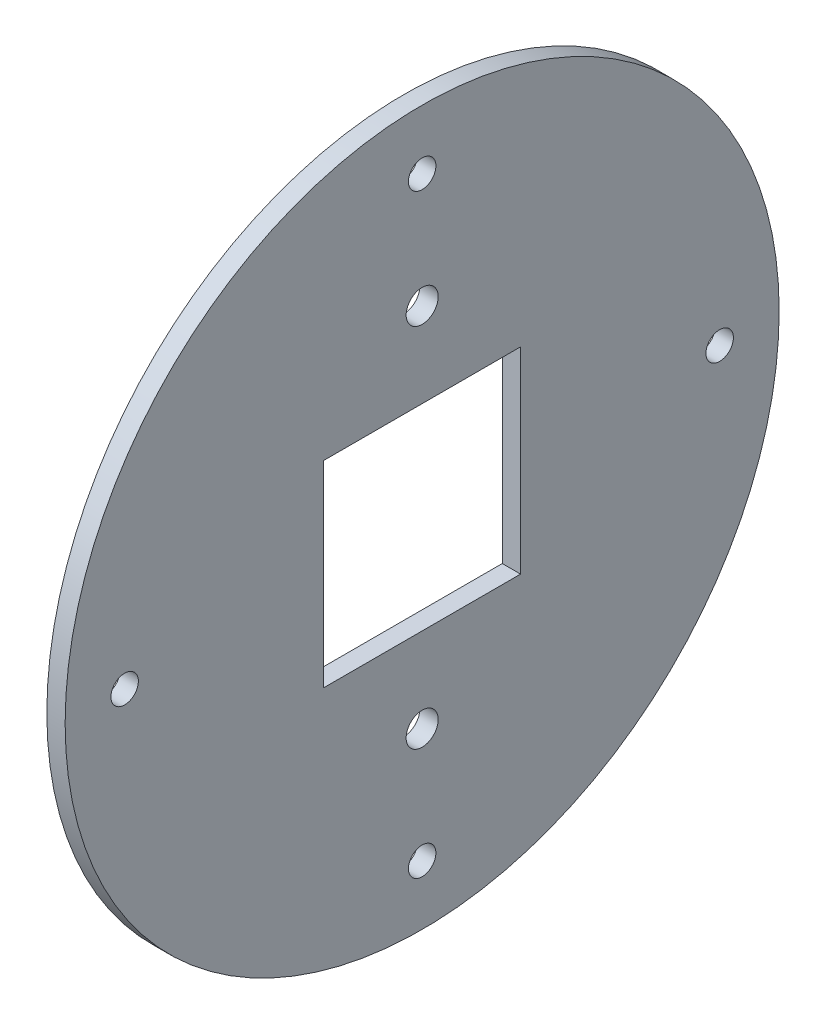
ISO-10303-21;
HEADER;
FILE_DESCRIPTION(('STEP AP214'),'2;1');
FILE_NAME('part.step','',(''),(''),'','','');
FILE_SCHEMA(('AUTOMOTIVE_DESIGN { 1 0 10303 214 1 1 1 1 }'));
ENDSEC;
DATA;
#1=APPLICATION_CONTEXT('core data for automotive mechanical design processes');
#2=APPLICATION_PROTOCOL_DEFINITION('international standard','automotive_design',2000,#1);
#3=PRODUCT_CONTEXT('',#1,'mechanical');
#4=PRODUCT('Part','Part','',(#3));
#5=PRODUCT_RELATED_PRODUCT_CATEGORY('part','',(#4));
#6=PRODUCT_DEFINITION_FORMATION('','',#4);
#7=PRODUCT_DEFINITION_CONTEXT('part definition',#1,'design');
#8=PRODUCT_DEFINITION('design','',#6,#7);
#9=PRODUCT_DEFINITION_SHAPE('','',#8);
#10=(LENGTH_UNIT() NAMED_UNIT(*) SI_UNIT(.MILLI.,.METRE.));
#11=(NAMED_UNIT(*) PLANE_ANGLE_UNIT() SI_UNIT($,.RADIAN.));
#12=(NAMED_UNIT(*) SI_UNIT($,.STERADIAN.) SOLID_ANGLE_UNIT());
#13=UNCERTAINTY_MEASURE_WITH_UNIT(LENGTH_MEASURE(1.E-05),#10,'distance_accuracy_value','');
#14=(GEOMETRIC_REPRESENTATION_CONTEXT(3) GLOBAL_UNCERTAINTY_ASSIGNED_CONTEXT((#13)) GLOBAL_UNIT_ASSIGNED_CONTEXT((#10,
#11,#12)) REPRESENTATION_CONTEXT('',''));
#15=CARTESIAN_POINT('',(0.,0.,0.));
#16=DIRECTION('',(0.,0.,1.));
#17=DIRECTION('',(1.,0.,0.));
#18=AXIS2_PLACEMENT_3D('',#15,#16,#17);
#19=CARTESIAN_POINT('',(8.,0.,0.));
#20=DIRECTION('',(-1.,0.,0.));
#21=DIRECTION('',(0.,0.,1.));
#22=AXIS2_PLACEMENT_3D('',#19,#20,#21);
#23=CYLINDRICAL_SURFACE('',#22,156.);
#24=CARTESIAN_POINT('',(8.,0.,0.));
#25=DIRECTION('',(1.,0.,0.));
#26=DIRECTION('',(0.,0.,-1.));
#27=AXIS2_PLACEMENT_3D('',#24,#25,#26);
#28=CIRCLE('',#27,156.);
#29=CARTESIAN_POINT('',(8.,0.,-156.));
#30=VERTEX_POINT('',#29);
#31=EDGE_CURVE('E136',#30,#30,#28,.T.);
#32=ORIENTED_EDGE('',*,*,#31,.F.);
#33=EDGE_LOOP('',(#32));
#34=FACE_BOUND('',#33,.T.);
#35=CARTESIAN_POINT('',(0.,0.,0.));
#36=DIRECTION('',(1.,0.,0.));
#37=DIRECTION('',(0.,0.,-1.));
#38=AXIS2_PLACEMENT_3D('',#35,#36,#37);
#39=CIRCLE('',#38,156.);
#40=CARTESIAN_POINT('',(0.,0.,-156.));
#41=VERTEX_POINT('',#40);
#42=EDGE_CURVE('E141',#41,#41,#39,.T.);
#43=ORIENTED_EDGE('',*,*,#42,.T.);
#44=EDGE_LOOP('',(#43));
#45=FACE_BOUND('',#44,.T.);
#46=ADVANCED_FACE('F39',(#34,#45),#23,.T.);
#47=CARTESIAN_POINT('',(8.,0.,0.));
#48=DIRECTION('',(1.,0.,0.));
#49=DIRECTION('',(0.,0.,-1.));
#50=AXIS2_PLACEMENT_3D('',#47,#48,#49);
#51=PLANE('',#50);
#52=CARTESIAN_POINT('',(8.,80.,0.));
#53=DIRECTION('',(1.,0.,0.));
#54=DIRECTION('',(0.,0.,-1.));
#55=AXIS2_PLACEMENT_3D('',#52,#53,#54);
#56=CIRCLE('',#55,7.);
#57=CARTESIAN_POINT('',(8.,80.,-7.));
#58=VERTEX_POINT('',#57);
#59=EDGE_CURVE('E167',#58,#58,#56,.T.);
#60=ORIENTED_EDGE('',*,*,#59,.F.);
#61=EDGE_LOOP('',(#60));
#62=FACE_BOUND('',#61,.T.);
#63=CARTESIAN_POINT('',(8.,-80.,0.));
#64=DIRECTION('',(1.,0.,0.));
#65=DIRECTION('',(0.,0.,-1.));
#66=AXIS2_PLACEMENT_3D('',#63,#64,#65);
#67=CIRCLE('',#66,7.);
#68=CARTESIAN_POINT('',(8.,-80.,-7.));
#69=VERTEX_POINT('',#68);
#70=EDGE_CURVE('E174',#69,#69,#67,.T.);
#71=ORIENTED_EDGE('',*,*,#70,.F.);
#72=EDGE_LOOP('',(#71));
#73=FACE_BOUND('',#72,.T.);
#74=DIRECTION('',(0.,1.,0.));
#75=VECTOR('',#74,1.);
#76=CARTESIAN_POINT('',(8.,-42.9999999999999,-42.9999999999999));
#77=LINE('',#76,#75);
#78=CARTESIAN_POINT('',(8.,-42.9999999999999,-42.9999999999999));
#79=VERTEX_POINT('',#78);
#80=CARTESIAN_POINT('',(8.,43.0000000000001,-42.9999999999999));
#81=VERTEX_POINT('',#80);
#82=EDGE_CURVE('E56',#79,#81,#77,.T.);
#83=ORIENTED_EDGE('',*,*,#82,.F.);
#84=DIRECTION('',(0.,0.,-1.));
#85=VECTOR('',#84,1.);
#86=CARTESIAN_POINT('',(8.,-43.0000000000002,43.0000000000001));
#87=LINE('',#86,#85);
#88=CARTESIAN_POINT('',(8.,-43.0000000000002,43.0000000000001));
#89=VERTEX_POINT('',#88);
#90=EDGE_CURVE('E103',#89,#79,#87,.T.);
#91=ORIENTED_EDGE('',*,*,#90,.F.);
#92=DIRECTION('',(0.,-1.,0.));
#93=VECTOR('',#92,1.);
#94=CARTESIAN_POINT('',(8.,-43.0000000000002,43.0000000000001));
#95=LINE('',#94,#93);
#96=CARTESIAN_POINT('',(8.,43.0000000000001,43.0000000000001));
#97=VERTEX_POINT('',#96);
#98=EDGE_CURVE('E85',#97,#89,#95,.T.);
#99=ORIENTED_EDGE('',*,*,#98,.F.);
#100=DIRECTION('',(0.,0.,1.));
#101=VECTOR('',#100,1.);
#102=CARTESIAN_POINT('',(8.,43.0000000000001,43.0000000000001));
#103=LINE('',#102,#101);
#104=EDGE_CURVE('E95',#81,#97,#103,.T.);
#105=ORIENTED_EDGE('',*,*,#104,.F.);
#106=EDGE_LOOP('',(#83,#91,#99,#105));
#107=FACE_BOUND('',#106,.T.);
#108=CARTESIAN_POINT('',(8.,-4.53892574049607E-13,130.));
#109=DIRECTION('',(1.,0.,0.));
#110=DIRECTION('',(0.,1.,0.));
#111=AXIS2_PLACEMENT_3D('',#108,#109,#110);
#112=CIRCLE('',#111,6.00000000000001);
#113=CARTESIAN_POINT('',(8.,5.99999999999955,130.));
#114=VERTEX_POINT('',#113);
#115=EDGE_CURVE('E118',#114,#114,#112,.T.);
#116=ORIENTED_EDGE('',*,*,#115,.F.);
#117=EDGE_LOOP('',(#116));
#118=FACE_BOUND('',#117,.T.);
#119=CARTESIAN_POINT('',(8.,-130.,0.));
#120=DIRECTION('',(1.,0.,0.));
#121=DIRECTION('',(0.,0.,1.));
#122=AXIS2_PLACEMENT_3D('',#119,#120,#121);
#123=CIRCLE('',#122,6.00000000000001);
#124=CARTESIAN_POINT('',(8.,-130.,6.00000000000001));
#125=VERTEX_POINT('',#124);
#126=EDGE_CURVE('E123',#125,#125,#123,.T.);
#127=ORIENTED_EDGE('',*,*,#126,.F.);
#128=EDGE_LOOP('',(#127));
#129=FACE_BOUND('',#128,.T.);
#130=CARTESIAN_POINT('',(8.,1.36167772214882E-12,-130.));
#131=DIRECTION('',(1.,0.,0.));
#132=DIRECTION('',(0.,-1.,0.));
#133=AXIS2_PLACEMENT_3D('',#130,#131,#132);
#134=CIRCLE('',#133,6.00000000000001);
#135=CARTESIAN_POINT('',(8.,-5.99999999999865,-130.));
#136=VERTEX_POINT('',#135);
#137=EDGE_CURVE('E113',#136,#136,#134,.T.);
#138=ORIENTED_EDGE('',*,*,#137,.F.);
#139=EDGE_LOOP('',(#138));
#140=FACE_BOUND('',#139,.T.);
#141=CARTESIAN_POINT('',(8.,130.,0.));
#142=DIRECTION('',(1.,0.,0.));
#143=DIRECTION('',(0.,0.,-1.));
#144=AXIS2_PLACEMENT_3D('',#141,#142,#143);
#145=CIRCLE('',#144,6.00000000000001);
#146=CARTESIAN_POINT('',(8.,130.,-6.00000000000001));
#147=VERTEX_POINT('',#146);
#148=EDGE_CURVE('E130',#147,#147,#145,.T.);
#149=ORIENTED_EDGE('',*,*,#148,.F.);
#150=EDGE_LOOP('',(#149));
#151=FACE_BOUND('',#150,.T.);
#152=ORIENTED_EDGE('',*,*,#31,.T.);
#153=EDGE_LOOP('',(#152));
#154=FACE_BOUND('',#153,.T.);
#155=ADVANCED_FACE('F100',(#62,#73,#107,#118,#129,#140,#151,#154),#51,.T.);
#156=CARTESIAN_POINT('',(0.,0.,0.));
#157=DIRECTION('',(1.,0.,0.));
#158=DIRECTION('',(0.,0.,-1.));
#159=AXIS2_PLACEMENT_3D('',#156,#157,#158);
#160=PLANE('',#159);
#161=CARTESIAN_POINT('',(0.,80.,0.));
#162=DIRECTION('',(1.,0.,0.));
#163=DIRECTION('',(0.,0.,-1.));
#164=AXIS2_PLACEMENT_3D('',#161,#162,#163);
#165=CIRCLE('',#164,7.);
#166=CARTESIAN_POINT('',(0.,80.,-7.));
#167=VERTEX_POINT('',#166);
#168=EDGE_CURVE('E42',#167,#167,#165,.T.);
#169=ORIENTED_EDGE('',*,*,#168,.T.);
#170=EDGE_LOOP('',(#169));
#171=FACE_BOUND('',#170,.T.);
#172=CARTESIAN_POINT('',(0.,-80.,0.));
#173=DIRECTION('',(1.,0.,0.));
#174=DIRECTION('',(0.,0.,-1.));
#175=AXIS2_PLACEMENT_3D('',#172,#173,#174);
#176=CIRCLE('',#175,7.);
#177=CARTESIAN_POINT('',(0.,-80.,-7.));
#178=VERTEX_POINT('',#177);
#179=EDGE_CURVE('E164',#178,#178,#176,.T.);
#180=ORIENTED_EDGE('',*,*,#179,.T.);
#181=EDGE_LOOP('',(#180));
#182=FACE_BOUND('',#181,.T.);
#183=DIRECTION('',(0.,0.,-1.));
#184=VECTOR('',#183,1.);
#185=CARTESIAN_POINT('',(0.,-43.0000000000001,-1.56125112837913E-13));
#186=LINE('',#185,#184);
#187=CARTESIAN_POINT('',(0.,-43.0000000000002,43.0000000000001));
#188=VERTEX_POINT('',#187);
#189=CARTESIAN_POINT('',(0.,-42.9999999999999,-42.9999999999999));
#190=VERTEX_POINT('',#189);
#191=EDGE_CURVE('E48',#188,#190,#186,.T.);
#192=ORIENTED_EDGE('',*,*,#191,.T.);
#193=DIRECTION('',(0.,1.,0.));
#194=VECTOR('',#193,1.);
#195=CARTESIAN_POINT('',(0.,0.,-42.9999999999999));
#196=LINE('',#195,#194);
#197=CARTESIAN_POINT('',(0.,43.0000000000001,-42.9999999999999));
#198=VERTEX_POINT('',#197);
#199=EDGE_CURVE('E11',#190,#198,#196,.T.);
#200=ORIENTED_EDGE('',*,*,#199,.T.);
#201=DIRECTION('',(0.,0.,1.));
#202=VECTOR('',#201,1.);
#203=CARTESIAN_POINT('',(0.,43.0000000000001,0.));
#204=LINE('',#203,#202);
#205=CARTESIAN_POINT('',(0.,43.0000000000001,43.0000000000001));
#206=VERTEX_POINT('',#205);
#207=EDGE_CURVE('E140',#198,#206,#204,.T.);
#208=ORIENTED_EDGE('',*,*,#207,.T.);
#209=DIRECTION('',(0.,-1.,0.));
#210=VECTOR('',#209,1.);
#211=CARTESIAN_POINT('',(0.,0.,43.0000000000001));
#212=LINE('',#211,#210);
#213=EDGE_CURVE('E88',#206,#188,#212,.T.);
#214=ORIENTED_EDGE('',*,*,#213,.T.);
#215=EDGE_LOOP('',(#192,#200,#208,#214));
#216=FACE_BOUND('',#215,.T.);
#217=CARTESIAN_POINT('',(0.,-4.53892574049607E-13,130.));
#218=DIRECTION('',(1.,0.,0.));
#219=DIRECTION('',(0.,0.,-1.));
#220=AXIS2_PLACEMENT_3D('',#217,#218,#219);
#221=CIRCLE('',#220,6.00000000000001);
#222=CARTESIAN_POINT('',(0.,-4.53892574049607E-13,124.));
#223=VERTEX_POINT('',#222);
#224=EDGE_CURVE('E135',#223,#223,#221,.T.);
#225=ORIENTED_EDGE('',*,*,#224,.T.);
#226=EDGE_LOOP('',(#225));
#227=FACE_BOUND('',#226,.T.);
#228=CARTESIAN_POINT('',(0.,-130.,0.));
#229=DIRECTION('',(1.,0.,0.));
#230=DIRECTION('',(0.,0.,-1.));
#231=AXIS2_PLACEMENT_3D('',#228,#229,#230);
#232=CIRCLE('',#231,6.00000000000001);
#233=CARTESIAN_POINT('',(0.,-130.,-6.00000000000001));
#234=VERTEX_POINT('',#233);
#235=EDGE_CURVE('E151',#234,#234,#232,.T.);
#236=ORIENTED_EDGE('',*,*,#235,.T.);
#237=EDGE_LOOP('',(#236));
#238=FACE_BOUND('',#237,.T.);
#239=CARTESIAN_POINT('',(0.,1.36167772214882E-12,-130.));
#240=DIRECTION('',(1.,0.,0.));
#241=DIRECTION('',(0.,0.,-1.));
#242=AXIS2_PLACEMENT_3D('',#239,#240,#241);
#243=CIRCLE('',#242,6.00000000000001);
#244=CARTESIAN_POINT('',(0.,1.36167772214882E-12,-136.));
#245=VERTEX_POINT('',#244);
#246=EDGE_CURVE('E122',#245,#245,#243,.T.);
#247=ORIENTED_EDGE('',*,*,#246,.T.);
#248=EDGE_LOOP('',(#247));
#249=FACE_BOUND('',#248,.T.);
#250=CARTESIAN_POINT('',(0.,130.,0.));
#251=DIRECTION('',(1.,0.,0.));
#252=DIRECTION('',(0.,0.,-1.));
#253=AXIS2_PLACEMENT_3D('',#250,#251,#252);
#254=CIRCLE('',#253,6.00000000000001);
#255=CARTESIAN_POINT('',(0.,130.,-6.00000000000001));
#256=VERTEX_POINT('',#255);
#257=EDGE_CURVE('E134',#256,#256,#254,.T.);
#258=ORIENTED_EDGE('',*,*,#257,.T.);
#259=EDGE_LOOP('',(#258));
#260=FACE_BOUND('',#259,.T.);
#261=ORIENTED_EDGE('',*,*,#42,.F.);
#262=EDGE_LOOP('',(#261));
#263=FACE_BOUND('',#262,.T.);
#264=ADVANCED_FACE('F188',(#171,#182,#216,#227,#238,#249,#260,#263),#160,.F.);
#265=CARTESIAN_POINT('',(-2.,130.,0.));
#266=DIRECTION('',(1.,0.,0.));
#267=DIRECTION('',(0.,0.,-1.));
#268=AXIS2_PLACEMENT_3D('',#265,#266,#267);
#269=CYLINDRICAL_SURFACE('',#268,6.00000000000001);
#270=ORIENTED_EDGE('',*,*,#148,.T.);
#271=EDGE_LOOP('',(#270));
#272=FACE_BOUND('',#271,.T.);
#273=ORIENTED_EDGE('',*,*,#257,.F.);
#274=EDGE_LOOP('',(#273));
#275=FACE_BOUND('',#274,.T.);
#276=ADVANCED_FACE('F195',(#272,#275),#269,.F.);
#277=CARTESIAN_POINT('',(-2.,1.36167772214882E-12,-130.));
#278=DIRECTION('',(1.,0.,0.));
#279=DIRECTION('',(0.,0.,-1.));
#280=AXIS2_PLACEMENT_3D('',#277,#278,#279);
#281=CYLINDRICAL_SURFACE('',#280,6.00000000000001);
#282=ORIENTED_EDGE('',*,*,#137,.T.);
#283=EDGE_LOOP('',(#282));
#284=FACE_BOUND('',#283,.T.);
#285=ORIENTED_EDGE('',*,*,#246,.F.);
#286=EDGE_LOOP('',(#285));
#287=FACE_BOUND('',#286,.T.);
#288=ADVANCED_FACE('F201',(#284,#287),#281,.F.);
#289=CARTESIAN_POINT('',(-2.,-130.,0.));
#290=DIRECTION('',(1.,0.,0.));
#291=DIRECTION('',(0.,0.,-1.));
#292=AXIS2_PLACEMENT_3D('',#289,#290,#291);
#293=CYLINDRICAL_SURFACE('',#292,6.00000000000001);
#294=ORIENTED_EDGE('',*,*,#126,.T.);
#295=EDGE_LOOP('',(#294));
#296=FACE_BOUND('',#295,.T.);
#297=ORIENTED_EDGE('',*,*,#235,.F.);
#298=EDGE_LOOP('',(#297));
#299=FACE_BOUND('',#298,.T.);
#300=ADVANCED_FACE('F205',(#296,#299),#293,.F.);
#301=CARTESIAN_POINT('',(-2.,-4.53892574049607E-13,130.));
#302=DIRECTION('',(1.,0.,0.));
#303=DIRECTION('',(0.,0.,-1.));
#304=AXIS2_PLACEMENT_3D('',#301,#302,#303);
#305=CYLINDRICAL_SURFACE('',#304,6.00000000000001);
#306=ORIENTED_EDGE('',*,*,#115,.T.);
#307=EDGE_LOOP('',(#306));
#308=FACE_BOUND('',#307,.T.);
#309=ORIENTED_EDGE('',*,*,#224,.F.);
#310=EDGE_LOOP('',(#309));
#311=FACE_BOUND('',#310,.T.);
#312=ADVANCED_FACE('F209',(#308,#311),#305,.F.);
#313=CARTESIAN_POINT('',(-2.,-42.9999999999999,-42.9999999999999));
#314=DIRECTION('',(0.,0.,-1.));
#315=DIRECTION('',(-1.,0.,0.));
#316=AXIS2_PLACEMENT_3D('',#313,#314,#315);
#317=PLANE('',#316);
#318=DIRECTION('',(1.,0.,0.));
#319=VECTOR('',#318,1.);
#320=CARTESIAN_POINT('',(-2.,-42.9999999999999,-42.9999999999999));
#321=LINE('',#320,#319);
#322=EDGE_CURVE('E110',#190,#79,#321,.T.);
#323=ORIENTED_EDGE('',*,*,#322,.T.);
#324=ORIENTED_EDGE('',*,*,#82,.T.);
#325=DIRECTION('',(1.,0.,0.));
#326=VECTOR('',#325,1.);
#327=CARTESIAN_POINT('',(-2.,43.0000000000001,-42.9999999999999));
#328=LINE('',#327,#326);
#329=EDGE_CURVE('E92',#198,#81,#328,.T.);
#330=ORIENTED_EDGE('',*,*,#329,.F.);
#331=ORIENTED_EDGE('',*,*,#199,.F.);
#332=EDGE_LOOP('',(#323,#324,#330,#331));
#333=FACE_BOUND('',#332,.T.);
#334=ADVANCED_FACE('F213',(#333),#317,.F.);
#335=CARTESIAN_POINT('',(-2.,-43.0000000000002,43.0000000000001));
#336=DIRECTION('',(0.,-1.,0.));
#337=DIRECTION('',(0.,0.,-1.));
#338=AXIS2_PLACEMENT_3D('',#335,#336,#337);
#339=PLANE('',#338);
#340=DIRECTION('',(1.,0.,0.));
#341=VECTOR('',#340,1.);
#342=CARTESIAN_POINT('',(-2.,-43.0000000000002,43.0000000000001));
#343=LINE('',#342,#341);
#344=EDGE_CURVE('E91',#188,#89,#343,.T.);
#345=ORIENTED_EDGE('',*,*,#344,.T.);
#346=ORIENTED_EDGE('',*,*,#90,.T.);
#347=ORIENTED_EDGE('',*,*,#322,.F.);
#348=ORIENTED_EDGE('',*,*,#191,.F.);
#349=EDGE_LOOP('',(#345,#346,#347,#348));
#350=FACE_BOUND('',#349,.T.);
#351=ADVANCED_FACE('F217',(#350),#339,.F.);
#352=CARTESIAN_POINT('',(-2.,-43.0000000000002,43.0000000000001));
#353=DIRECTION('',(0.,0.,1.));
#354=DIRECTION('',(1.,0.,0.));
#355=AXIS2_PLACEMENT_3D('',#352,#353,#354);
#356=PLANE('',#355);
#357=DIRECTION('',(1.,0.,0.));
#358=VECTOR('',#357,1.);
#359=CARTESIAN_POINT('',(-2.,43.0000000000001,43.0000000000001));
#360=LINE('',#359,#358);
#361=EDGE_CURVE('E64',#206,#97,#360,.T.);
#362=ORIENTED_EDGE('',*,*,#361,.T.);
#363=ORIENTED_EDGE('',*,*,#98,.T.);
#364=ORIENTED_EDGE('',*,*,#344,.F.);
#365=ORIENTED_EDGE('',*,*,#213,.F.);
#366=EDGE_LOOP('',(#362,#363,#364,#365));
#367=FACE_BOUND('',#366,.T.);
#368=ADVANCED_FACE('F82',(#367),#356,.F.);
#369=CARTESIAN_POINT('',(-2.,43.0000000000001,43.0000000000001));
#370=DIRECTION('',(0.,1.,0.));
#371=DIRECTION('',(0.,0.,1.));
#372=AXIS2_PLACEMENT_3D('',#369,#370,#371);
#373=PLANE('',#372);
#374=ORIENTED_EDGE('',*,*,#329,.T.);
#375=ORIENTED_EDGE('',*,*,#104,.T.);
#376=ORIENTED_EDGE('',*,*,#361,.F.);
#377=ORIENTED_EDGE('',*,*,#207,.F.);
#378=EDGE_LOOP('',(#374,#375,#376,#377));
#379=FACE_BOUND('',#378,.T.);
#380=ADVANCED_FACE('F96',(#379),#373,.F.);
#381=CARTESIAN_POINT('',(-2.,-80.,0.));
#382=DIRECTION('',(1.,0.,0.));
#383=DIRECTION('',(0.,0.,-1.));
#384=AXIS2_PLACEMENT_3D('',#381,#382,#383);
#385=CYLINDRICAL_SURFACE('',#384,7.);
#386=ORIENTED_EDGE('',*,*,#70,.T.);
#387=EDGE_LOOP('',(#386));
#388=FACE_BOUND('',#387,.T.);
#389=ORIENTED_EDGE('',*,*,#179,.F.);
#390=EDGE_LOOP('',(#389));
#391=FACE_BOUND('',#390,.T.);
#392=ADVANCED_FACE('F184',(#388,#391),#385,.F.);
#393=CARTESIAN_POINT('',(-2.,80.,0.));
#394=DIRECTION('',(1.,0.,0.));
#395=DIRECTION('',(0.,0.,-1.));
#396=AXIS2_PLACEMENT_3D('',#393,#394,#395);
#397=CYLINDRICAL_SURFACE('',#396,7.);
#398=ORIENTED_EDGE('',*,*,#59,.T.);
#399=EDGE_LOOP('',(#398));
#400=FACE_BOUND('',#399,.T.);
#401=ORIENTED_EDGE('',*,*,#168,.F.);
#402=EDGE_LOOP('',(#401));
#403=FACE_BOUND('',#402,.T.);
#404=ADVANCED_FACE('F227',(#400,#403),#397,.F.);
#405=CLOSED_SHELL('',(#46,#155,#264,#276,#288,#300,#312,#334,#351,#368,#380,#392,#404));
#406=MANIFOLD_SOLID_BREP('B2',#405);
#407=ADVANCED_BREP_SHAPE_REPRESENTATION('',(#18,#406),#14);
#408=SHAPE_DEFINITION_REPRESENTATION(#9,#407);
ENDSEC;
END-ISO-10303-21;
